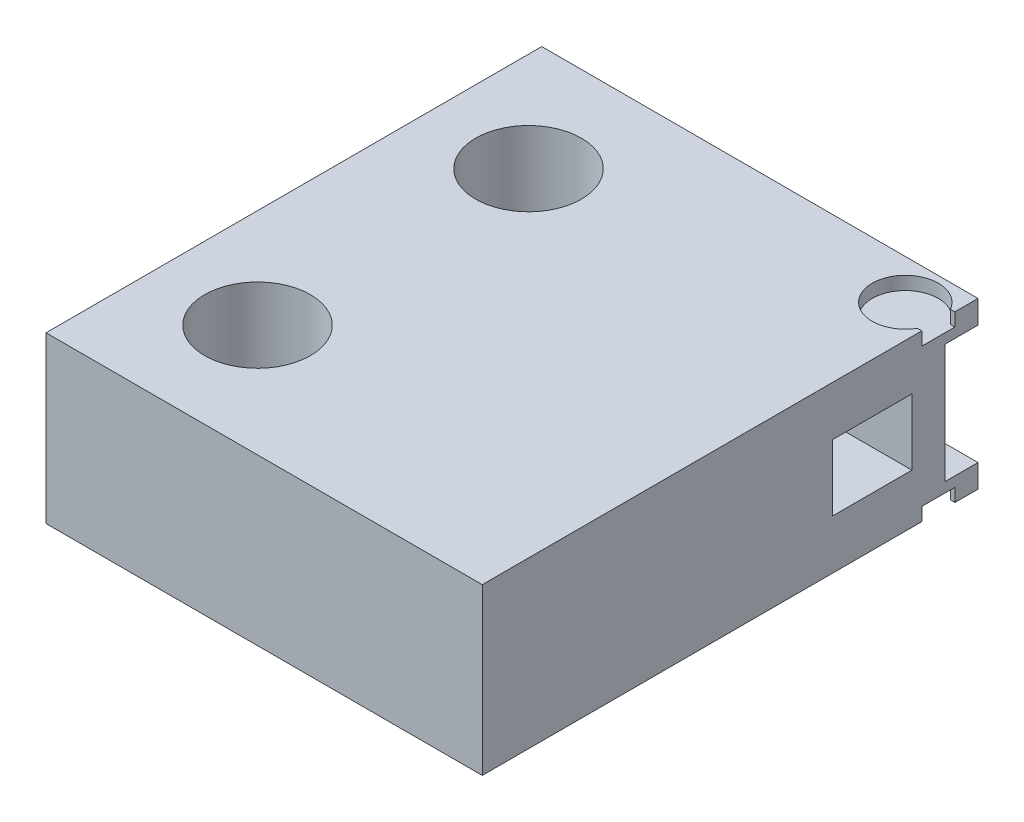
ISO-10303-21;
HEADER;
FILE_DESCRIPTION(('STEP AP214'),'2;1');
FILE_NAME('part.step','',(''),(''),'','','');
FILE_SCHEMA(('AUTOMOTIVE_DESIGN { 1 0 10303 214 1 1 1 1 }'));
ENDSEC;
DATA;
#1=APPLICATION_CONTEXT('core data for automotive mechanical design processes');
#2=APPLICATION_PROTOCOL_DEFINITION('international standard','automotive_design',2000,#1);
#3=PRODUCT_CONTEXT('',#1,'mechanical');
#4=PRODUCT('Part','Part','',(#3));
#5=PRODUCT_RELATED_PRODUCT_CATEGORY('part','',(#4));
#6=PRODUCT_DEFINITION_FORMATION('','',#4);
#7=PRODUCT_DEFINITION_CONTEXT('part definition',#1,'design');
#8=PRODUCT_DEFINITION('design','',#6,#7);
#9=PRODUCT_DEFINITION_SHAPE('','',#8);
#10=(LENGTH_UNIT() NAMED_UNIT(*) SI_UNIT(.MILLI.,.METRE.));
#11=(NAMED_UNIT(*) PLANE_ANGLE_UNIT() SI_UNIT($,.RADIAN.));
#12=(NAMED_UNIT(*) SI_UNIT($,.STERADIAN.) SOLID_ANGLE_UNIT());
#13=UNCERTAINTY_MEASURE_WITH_UNIT(LENGTH_MEASURE(1.E-05),#10,'distance_accuracy_value','');
#14=(GEOMETRIC_REPRESENTATION_CONTEXT(3) GLOBAL_UNCERTAINTY_ASSIGNED_CONTEXT((#13)) GLOBAL_UNIT_ASSIGNED_CONTEXT((#10,
#11,#12)) REPRESENTATION_CONTEXT('',''));
#15=CARTESIAN_POINT('',(0.,0.,0.));
#16=DIRECTION('',(0.,0.,1.));
#17=DIRECTION('',(1.,0.,0.));
#18=AXIS2_PLACEMENT_3D('',#15,#16,#17);
#19=CARTESIAN_POINT('',(93.8,-96.95,20.05551362713));
#20=DIRECTION('',(0.,0.,1.));
#21=DIRECTION('',(1.,0.,0.));
#22=AXIS2_PLACEMENT_3D('',#19,#20,#21);
#23=PLANE('',#22);
#24=DIRECTION('',(0.,1.,0.));
#25=VECTOR('',#24,1.);
#26=CARTESIAN_POINT('',(92.8,-96.95,20.05551362713));
#27=LINE('',#26,#25);
#28=CARTESIAN_POINT('',(92.8,-96.45,20.05551362713));
#29=VERTEX_POINT('',#28);
#30=CARTESIAN_POINT('',(92.8,-97.45,20.05551362713));
#31=VERTEX_POINT('',#30);
#32=EDGE_CURVE('E330',#29,#31,#27,.F.);
#33=ORIENTED_EDGE('',*,*,#32,.F.);
#34=DIRECTION('',(1.,0.,0.));
#35=VECTOR('',#34,1.);
#36=CARTESIAN_POINT('',(93.8,-96.45,20.05551362713));
#37=LINE('',#36,#35);
#38=CARTESIAN_POINT('',(94.8,-96.45,20.05551362713));
#39=VERTEX_POINT('',#38);
#40=EDGE_CURVE('E335',#29,#39,#37,.T.);
#41=ORIENTED_EDGE('',*,*,#40,.T.);
#42=DIRECTION('',(0.,1.,0.));
#43=VECTOR('',#42,1.);
#44=CARTESIAN_POINT('',(94.8,-96.95,20.05551362713));
#45=LINE('',#44,#43);
#46=CARTESIAN_POINT('',(94.8,-97.45,20.05551362713));
#47=VERTEX_POINT('',#46);
#48=EDGE_CURVE('E341',#47,#39,#45,.T.);
#49=ORIENTED_EDGE('',*,*,#48,.F.);
#50=DIRECTION('',(1.,0.,0.));
#51=VECTOR('',#50,1.);
#52=CARTESIAN_POINT('',(93.8,-97.45,20.05551362713));
#53=LINE('',#52,#51);
#54=EDGE_CURVE('E324',#31,#47,#53,.T.);
#55=ORIENTED_EDGE('',*,*,#54,.F.);
#56=EDGE_LOOP('',(#33,#41,#49,#55));
#57=FACE_BOUND('',#56,.T.);
#58=ADVANCED_FACE('F17',(#57),#23,.F.);
#59=CARTESIAN_POINT('',(93.8,-96.95,18.15551362713));
#60=DIRECTION('',(0.,0.,1.));
#61=DIRECTION('',(1.,0.,0.));
#62=AXIS2_PLACEMENT_3D('',#59,#60,#61);
#63=PLANE('',#62);
#64=DIRECTION('',(0.,1.,0.));
#65=VECTOR('',#64,1.);
#66=CARTESIAN_POINT('',(93.2,-96.95,18.15551362713));
#67=LINE('',#66,#65);
#68=CARTESIAN_POINT('',(93.2,-96.05,18.15551362713));
#69=VERTEX_POINT('',#68);
#70=CARTESIAN_POINT('',(93.2,-97.85,18.15551362713));
#71=VERTEX_POINT('',#70);
#72=EDGE_CURVE('E279',#69,#71,#67,.F.);
#73=ORIENTED_EDGE('',*,*,#72,.F.);
#74=DIRECTION('',(1.,0.,0.));
#75=VECTOR('',#74,1.);
#76=CARTESIAN_POINT('',(94.,-96.05,18.15551362713));
#77=LINE('',#76,#75);
#78=CARTESIAN_POINT('',(94.4000000000012,-96.05,18.1555136271281));
#79=VERTEX_POINT('',#78);
#80=EDGE_CURVE('E127',#69,#79,#77,.T.);
#81=ORIENTED_EDGE('',*,*,#80,.T.);
#82=DIRECTION('',(0.,1.,0.));
#83=VECTOR('',#82,1.);
#84=CARTESIAN_POINT('',(94.4000000000019,-96.95,18.1555136271262));
#85=LINE('',#84,#83);
#86=CARTESIAN_POINT('',(94.4000000000005,-97.85,18.1555136271291));
#87=VERTEX_POINT('',#86);
#88=EDGE_CURVE('E132',#79,#87,#85,.F.);
#89=ORIENTED_EDGE('',*,*,#88,.T.);
#90=DIRECTION('',(1.,0.,0.));
#91=VECTOR('',#90,1.);
#92=CARTESIAN_POINT('',(94.,-97.85,18.15551362713));
#93=LINE('',#92,#91);
#94=EDGE_CURVE('E74',#71,#87,#93,.T.);
#95=ORIENTED_EDGE('',*,*,#94,.F.);
#96=EDGE_LOOP('',(#73,#81,#89,#95));
#97=FACE_BOUND('',#96,.T.);
#98=ADVANCED_FACE('F451',(#97),#63,.F.);
#99=CARTESIAN_POINT('',(93.8,-96.45,19.45551362713));
#100=DIRECTION('',(0.,1.,0.));
#101=DIRECTION('',(0.,0.,1.));
#102=AXIS2_PLACEMENT_3D('',#99,#100,#101);
#103=PLANE('',#102);
#104=DIRECTION('',(0.,0.,-1.));
#105=VECTOR('',#104,1.);
#106=CARTESIAN_POINT('',(92.8,-96.45,19.45551362713));
#107=LINE('',#106,#105);
#108=CARTESIAN_POINT('',(92.8,-96.45,18.85551362713));
#109=VERTEX_POINT('',#108);
#110=EDGE_CURVE('E332',#109,#29,#107,.F.);
#111=ORIENTED_EDGE('',*,*,#110,.F.);
#112=DIRECTION('',(1.,0.,0.));
#113=VECTOR('',#112,1.);
#114=CARTESIAN_POINT('',(93.8,-96.45,18.85551362713));
#115=LINE('',#114,#113);
#116=CARTESIAN_POINT('',(94.8,-96.45,18.85551362713));
#117=VERTEX_POINT('',#116);
#118=EDGE_CURVE('E244',#117,#109,#115,.F.);
#119=ORIENTED_EDGE('',*,*,#118,.F.);
#120=DIRECTION('',(0.,0.,1.));
#121=VECTOR('',#120,1.);
#122=CARTESIAN_POINT('',(94.8,-96.45,19.45551362713));
#123=LINE('',#122,#121);
#124=EDGE_CURVE('E338',#39,#117,#123,.F.);
#125=ORIENTED_EDGE('',*,*,#124,.F.);
#126=ORIENTED_EDGE('',*,*,#40,.F.);
#127=EDGE_LOOP('',(#111,#119,#125,#126));
#128=FACE_BOUND('',#127,.T.);
#129=ADVANCED_FACE('F446',(#128),#103,.F.);
#130=CARTESIAN_POINT('',(92.8,-96.95,19.45551362713));
#131=DIRECTION('',(1.,0.,0.));
#132=DIRECTION('',(0.,0.,-1.));
#133=AXIS2_PLACEMENT_3D('',#130,#131,#132);
#134=PLANE('',#133);
#135=DIRECTION('',(0.,0.,1.));
#136=VECTOR('',#135,1.);
#137=CARTESIAN_POINT('',(92.8,-97.45,19.45551362713));
#138=LINE('',#137,#136);
#139=CARTESIAN_POINT('',(92.8,-97.45,18.85551362713));
#140=VERTEX_POINT('',#139);
#141=EDGE_CURVE('E327',#140,#31,#138,.T.);
#142=ORIENTED_EDGE('',*,*,#141,.F.);
#143=DIRECTION('',(0.,1.,0.));
#144=VECTOR('',#143,1.);
#145=CARTESIAN_POINT('',(92.8,-96.95,18.85551362713));
#146=LINE('',#145,#144);
#147=EDGE_CURVE('E241',#109,#140,#146,.F.);
#148=ORIENTED_EDGE('',*,*,#147,.F.);
#149=ORIENTED_EDGE('',*,*,#110,.T.);
#150=ORIENTED_EDGE('',*,*,#32,.T.);
#151=EDGE_LOOP('',(#142,#148,#149,#150));
#152=FACE_BOUND('',#151,.T.);
#153=ADVANCED_FACE('F433',(#152),#134,.T.);
#154=CARTESIAN_POINT('',(93.8,-97.45,19.45551362713));
#155=DIRECTION('',(0.,1.,0.));
#156=DIRECTION('',(0.,0.,1.));
#157=AXIS2_PLACEMENT_3D('',#154,#155,#156);
#158=PLANE('',#157);
#159=ORIENTED_EDGE('',*,*,#54,.T.);
#160=DIRECTION('',(0.,0.,1.));
#161=VECTOR('',#160,1.);
#162=CARTESIAN_POINT('',(94.8,-97.45,19.45551362713));
#163=LINE('',#162,#161);
#164=CARTESIAN_POINT('',(94.8,-97.45,18.85551362713));
#165=VERTEX_POINT('',#164);
#166=EDGE_CURVE('E321',#47,#165,#163,.F.);
#167=ORIENTED_EDGE('',*,*,#166,.T.);
#168=DIRECTION('',(1.,0.,0.));
#169=VECTOR('',#168,1.);
#170=CARTESIAN_POINT('',(93.8,-97.45,18.85551362713));
#171=LINE('',#170,#169);
#172=EDGE_CURVE('E220',#140,#165,#171,.T.);
#173=ORIENTED_EDGE('',*,*,#172,.F.);
#174=ORIENTED_EDGE('',*,*,#141,.T.);
#175=EDGE_LOOP('',(#159,#167,#173,#174));
#176=FACE_BOUND('',#175,.T.);
#177=ADVANCED_FACE('F437',(#176),#158,.T.);
#178=CARTESIAN_POINT('',(94.3,-97.9876417477,18.45551362713));
#179=DIRECTION('',(0.,-1.,0.));
#180=DIRECTION('',(0.,0.,-1.));
#181=AXIS2_PLACEMENT_3D('',#178,#179,#180);
#182=CYLINDRICAL_SURFACE('',#181,0.5);
#183=DIRECTION('',(0.,1.,0.));
#184=VECTOR('',#183,1.);
#185=CARTESIAN_POINT('',(94.73301270189,-98.1,18.20551362713));
#186=LINE('',#185,#184);
#187=CARTESIAN_POINT('',(94.7330127018911,-98.,18.20551362713));
#188=VERTEX_POINT('',#187);
#189=CARTESIAN_POINT('',(94.7330127018911,-98.2,18.20551362713));
#190=VERTEX_POINT('',#189);
#191=EDGE_CURVE('E315',#188,#190,#186,.F.);
#192=ORIENTED_EDGE('',*,*,#191,.F.);
#193=CARTESIAN_POINT('',(94.3,-98.,18.45551362713));
#194=DIRECTION('',(0.,-1.,0.));
#195=DIRECTION('',(0.,0.,-1.));
#196=AXIS2_PLACEMENT_3D('',#193,#194,#195);
#197=CIRCLE('',#196,0.5);
#198=CARTESIAN_POINT('',(94.7330127018911,-98.,18.70551362713));
#199=VERTEX_POINT('',#198);
#200=EDGE_CURVE('E20',#188,#199,#197,.F.);
#201=ORIENTED_EDGE('',*,*,#200,.T.);
#202=DIRECTION('',(0.,1.,0.));
#203=VECTOR('',#202,1.);
#204=CARTESIAN_POINT('',(94.73301270189,-98.1,18.70551362713));
#205=LINE('',#204,#203);
#206=CARTESIAN_POINT('',(94.7330127018911,-98.2,18.70551362713));
#207=VERTEX_POINT('',#206);
#208=EDGE_CURVE('E278',#199,#207,#205,.F.);
#209=ORIENTED_EDGE('',*,*,#208,.T.);
#210=CARTESIAN_POINT('',(94.3,-98.2,18.45551362713));
#211=DIRECTION('',(0.,-1.,0.));
#212=DIRECTION('',(0.,0.,-1.));
#213=AXIS2_PLACEMENT_3D('',#210,#211,#212);
#214=CIRCLE('',#213,0.5);
#215=EDGE_CURVE('E215',#207,#190,#214,.T.);
#216=ORIENTED_EDGE('',*,*,#215,.T.);
#217=EDGE_LOOP('',(#192,#201,#209,#216));
#218=FACE_BOUND('',#217,.T.);
#219=ADVANCED_FACE('F383',(#218),#182,.F.);
#220=CARTESIAN_POINT('',(94.,-96.05,18.10551362713));
#221=DIRECTION('',(0.,1.,0.));
#222=DIRECTION('',(0.,0.,1.));
#223=AXIS2_PLACEMENT_3D('',#220,#221,#222);
#224=PLANE('',#223);
#225=DIRECTION('',(1.,0.,0.));
#226=VECTOR('',#225,1.);
#227=CARTESIAN_POINT('',(91.5,-96.05,17.85551362713));
#228=LINE('',#227,#226);
#229=CARTESIAN_POINT('',(93.2,-96.05,17.85551362713));
#230=VERTEX_POINT('',#229);
#231=CARTESIAN_POINT('',(94.8,-96.05,17.85551362713));
#232=VERTEX_POINT('',#231);
#233=EDGE_CURVE('E231',#230,#232,#228,.T.);
#234=ORIENTED_EDGE('',*,*,#233,.T.);
#235=DIRECTION('',(0.,0.,1.));
#236=VECTOR('',#235,1.);
#237=CARTESIAN_POINT('',(94.8,-96.05,18.10551362713));
#238=LINE('',#237,#236);
#239=CARTESIAN_POINT('',(94.8,-96.05,18.35551362713));
#240=VERTEX_POINT('',#239);
#241=EDGE_CURVE('E285',#240,#232,#238,.F.);
#242=ORIENTED_EDGE('',*,*,#241,.F.);
#243=DIRECTION('',(0.894427190991436,0.,0.447213595516918));
#244=VECTOR('',#243,1.);
#245=CARTESIAN_POINT('',(94.6,-96.05,18.25551362713));
#246=LINE('',#245,#244);
#247=EDGE_CURVE('E247',#240,#79,#246,.F.);
#248=ORIENTED_EDGE('',*,*,#247,.T.);
#249=ORIENTED_EDGE('',*,*,#80,.F.);
#250=DIRECTION('',(0.,0.,-1.));
#251=VECTOR('',#250,1.);
#252=CARTESIAN_POINT('',(93.2,-96.05,18.00551362713));
#253=LINE('',#252,#251);
#254=EDGE_CURVE('E283',#230,#69,#253,.F.);
#255=ORIENTED_EDGE('',*,*,#254,.F.);
#256=EDGE_LOOP('',(#234,#242,#248,#249,#255));
#257=FACE_BOUND('',#256,.T.);
#258=ADVANCED_FACE('F516',(#257),#224,.F.);
#259=CARTESIAN_POINT('',(94.,-97.85,18.10551362713));
#260=DIRECTION('',(0.,1.,0.));
#261=DIRECTION('',(0.,0.,1.));
#262=AXIS2_PLACEMENT_3D('',#259,#260,#261);
#263=PLANE('',#262);
#264=DIRECTION('',(0.894427190991436,0.,0.447213595516918));
#265=VECTOR('',#264,1.);
#266=CARTESIAN_POINT('',(94.6,-97.85,18.25551362713));
#267=LINE('',#266,#265);
#268=CARTESIAN_POINT('',(94.7999999999995,-97.85,18.3555136271309));
#269=VERTEX_POINT('',#268);
#270=EDGE_CURVE('E248',#87,#269,#267,.T.);
#271=ORIENTED_EDGE('',*,*,#270,.T.);
#272=DIRECTION('',(0.,0.,1.));
#273=VECTOR('',#272,1.);
#274=CARTESIAN_POINT('',(94.8,-97.85,18.10551362713));
#275=LINE('',#274,#273);
#276=CARTESIAN_POINT('',(94.8,-97.85,17.85551362713));
#277=VERTEX_POINT('',#276);
#278=EDGE_CURVE('E280',#269,#277,#275,.F.);
#279=ORIENTED_EDGE('',*,*,#278,.T.);
#280=DIRECTION('',(1.,0.,0.));
#281=VECTOR('',#280,1.);
#282=CARTESIAN_POINT('',(91.5,-97.85,17.85551362713));
#283=LINE('',#282,#281);
#284=CARTESIAN_POINT('',(93.2,-97.85,17.85551362713));
#285=VERTEX_POINT('',#284);
#286=EDGE_CURVE('E195',#277,#285,#283,.F.);
#287=ORIENTED_EDGE('',*,*,#286,.T.);
#288=DIRECTION('',(0.,0.,-1.));
#289=VECTOR('',#288,1.);
#290=CARTESIAN_POINT('',(93.2,-97.85,18.00551362713));
#291=LINE('',#290,#289);
#292=EDGE_CURVE('E275',#71,#285,#291,.T.);
#293=ORIENTED_EDGE('',*,*,#292,.F.);
#294=ORIENTED_EDGE('',*,*,#94,.T.);
#295=EDGE_LOOP('',(#271,#279,#287,#293,#294));
#296=FACE_BOUND('',#295,.T.);
#297=ADVANCED_FACE('F512',(#296),#263,.T.);
#298=CARTESIAN_POINT('',(93.2,-96.95,18.00551362713));
#299=DIRECTION('',(1.,0.,0.));
#300=DIRECTION('',(0.,0.,-1.));
#301=AXIS2_PLACEMENT_3D('',#298,#299,#300);
#302=PLANE('',#301);
#303=ORIENTED_EDGE('',*,*,#292,.T.);
#304=DIRECTION('',(0.,1.,0.));
#305=VECTOR('',#304,1.);
#306=CARTESIAN_POINT('',(93.2,-96.95,17.85551362713));
#307=LINE('',#306,#305);
#308=EDGE_CURVE('E197',#285,#230,#307,.T.);
#309=ORIENTED_EDGE('',*,*,#308,.T.);
#310=ORIENTED_EDGE('',*,*,#254,.T.);
#311=ORIENTED_EDGE('',*,*,#72,.T.);
#312=EDGE_LOOP('',(#303,#309,#310,#311));
#313=FACE_BOUND('',#312,.T.);
#314=ADVANCED_FACE('F509',(#313),#302,.T.);
#315=CARTESIAN_POINT('',(94.76650635094,-98.1,18.70551362713));
#316=DIRECTION('',(0.,0.,1.));
#317=DIRECTION('',(1.,0.,0.));
#318=AXIS2_PLACEMENT_3D('',#315,#316,#317);
#319=PLANE('',#318);
#320=DIRECTION('',(1.,0.,0.));
#321=VECTOR('',#320,1.);
#322=CARTESIAN_POINT('',(94.29961431678,-98.,18.70551362713));
#323=LINE('',#322,#321);
#324=CARTESIAN_POINT('',(94.8,-98.,18.70551362713));
#325=VERTEX_POINT('',#324);
#326=EDGE_CURVE('E251',#199,#325,#323,.T.);
#327=ORIENTED_EDGE('',*,*,#326,.T.);
#328=DIRECTION('',(0.,1.,0.));
#329=VECTOR('',#328,1.);
#330=CARTESIAN_POINT('',(94.8,-96.95,18.70551362713));
#331=LINE('',#330,#329);
#332=CARTESIAN_POINT('',(94.8,-98.2,18.70551362713));
#333=VERTEX_POINT('',#332);
#334=EDGE_CURVE('E262',#333,#325,#331,.T.);
#335=ORIENTED_EDGE('',*,*,#334,.F.);
#336=DIRECTION('',(1.,0.,0.));
#337=VECTOR('',#336,1.);
#338=CARTESIAN_POINT('',(91.5,-98.2,18.70551362713));
#339=LINE('',#338,#337);
#340=EDGE_CURVE('E212',#333,#207,#339,.F.);
#341=ORIENTED_EDGE('',*,*,#340,.T.);
#342=ORIENTED_EDGE('',*,*,#208,.F.);
#343=EDGE_LOOP('',(#327,#335,#341,#342));
#344=FACE_BOUND('',#343,.T.);
#345=ADVANCED_FACE('F396',(#344),#319,.F.);
#346=CARTESIAN_POINT('',(94.29961431678,-98.,18.45551362713));
#347=DIRECTION('',(0.,1.,0.));
#348=DIRECTION('',(0.,0.,1.));
#349=AXIS2_PLACEMENT_3D('',#346,#347,#348);
#350=PLANE('',#349);
#351=ORIENTED_EDGE('',*,*,#200,.F.);
#352=DIRECTION('',(1.,0.,0.));
#353=VECTOR('',#352,1.);
#354=CARTESIAN_POINT('',(94.76650635095,-98.,18.20551362713));
#355=LINE('',#354,#353);
#356=CARTESIAN_POINT('',(94.8,-98.,18.20551362713));
#357=VERTEX_POINT('',#356);
#358=EDGE_CURVE('E253',#357,#188,#355,.F.);
#359=ORIENTED_EDGE('',*,*,#358,.F.);
#360=DIRECTION('',(0.,0.,-1.));
#361=VECTOR('',#360,1.);
#362=CARTESIAN_POINT('',(94.8,-98.,21.60551362713));
#363=LINE('',#362,#361);
#364=EDGE_CURVE('E312',#325,#357,#363,.T.);
#365=ORIENTED_EDGE('',*,*,#364,.F.);
#366=ORIENTED_EDGE('',*,*,#326,.F.);
#367=EDGE_LOOP('',(#351,#359,#365,#366));
#368=FACE_BOUND('',#367,.T.);
#369=ADVANCED_FACE('F392',(#368),#350,.F.);
#370=CARTESIAN_POINT('',(94.76650635095,-98.1,18.20551362713));
#371=DIRECTION('',(0.,0.,1.));
#372=DIRECTION('',(1.,0.,0.));
#373=AXIS2_PLACEMENT_3D('',#370,#371,#372);
#374=PLANE('',#373);
#375=ORIENTED_EDGE('',*,*,#191,.T.);
#376=DIRECTION('',(1.,0.,0.));
#377=VECTOR('',#376,1.);
#378=CARTESIAN_POINT('',(91.5,-98.2,18.20551362713));
#379=LINE('',#378,#377);
#380=CARTESIAN_POINT('',(94.8,-98.2,18.20551362713));
#381=VERTEX_POINT('',#380);
#382=EDGE_CURVE('E216',#190,#381,#379,.T.);
#383=ORIENTED_EDGE('',*,*,#382,.T.);
#384=DIRECTION('',(0.,1.,0.));
#385=VECTOR('',#384,1.);
#386=CARTESIAN_POINT('',(94.8,-96.95,18.20551362713));
#387=LINE('',#386,#385);
#388=EDGE_CURVE('E295',#357,#381,#387,.F.);
#389=ORIENTED_EDGE('',*,*,#388,.F.);
#390=ORIENTED_EDGE('',*,*,#358,.T.);
#391=EDGE_LOOP('',(#375,#383,#389,#390));
#392=FACE_BOUND('',#391,.T.);
#393=ADVANCED_FACE('F389',(#392),#374,.T.);
#394=CARTESIAN_POINT('',(94.6,-96.95,18.25551362713));
#395=DIRECTION('',(-0.447213595516918,0.,0.894427190991436));
#396=DIRECTION('',(0.894427190991436,0.,0.447213595516918));
#397=AXIS2_PLACEMENT_3D('',#394,#395,#396);
#398=PLANE('',#397);
#399=DIRECTION('',(0.,1.,0.));
#400=VECTOR('',#399,1.);
#401=CARTESIAN_POINT('',(94.8,-96.95,18.35551362713));
#402=LINE('',#401,#400);
#403=EDGE_CURVE('E289',#269,#240,#402,.T.);
#404=ORIENTED_EDGE('',*,*,#403,.F.);
#405=ORIENTED_EDGE('',*,*,#270,.F.);
#406=ORIENTED_EDGE('',*,*,#88,.F.);
#407=ORIENTED_EDGE('',*,*,#247,.F.);
#408=EDGE_LOOP('',(#404,#405,#406,#407));
#409=FACE_BOUND('',#408,.T.);
#410=ADVANCED_FACE('F499',(#409),#398,.F.);
#411=CARTESIAN_POINT('',(93.8,-96.95,18.85551362713));
#412=DIRECTION('',(0.,0.,1.));
#413=DIRECTION('',(1.,0.,0.));
#414=AXIS2_PLACEMENT_3D('',#411,#412,#413);
#415=PLANE('',#414);
#416=ORIENTED_EDGE('',*,*,#172,.T.);
#417=DIRECTION('',(0.,1.,0.));
#418=VECTOR('',#417,1.);
#419=CARTESIAN_POINT('',(94.8,-96.95,18.85551362713));
#420=LINE('',#419,#418);
#421=EDGE_CURVE('E226',#117,#165,#420,.F.);
#422=ORIENTED_EDGE('',*,*,#421,.F.);
#423=ORIENTED_EDGE('',*,*,#118,.T.);
#424=ORIENTED_EDGE('',*,*,#147,.T.);
#425=EDGE_LOOP('',(#416,#422,#423,#424));
#426=FACE_BOUND('',#425,.T.);
#427=ADVANCED_FACE('F442',(#426),#415,.T.);
#428=CARTESIAN_POINT('',(94.29961431678,-95.9,18.45551362713));
#429=DIRECTION('',(0.,1.,0.));
#430=DIRECTION('',(0.,0.,1.));
#431=AXIS2_PLACEMENT_3D('',#428,#429,#430);
#432=PLANE('',#431);
#433=DIRECTION('',(1.,0.,0.));
#434=VECTOR('',#433,1.);
#435=CARTESIAN_POINT('',(94.76650635095,-95.9,18.70551362713));
#436=LINE('',#435,#434);
#437=CARTESIAN_POINT('',(94.7330127018919,-95.9,18.7055136271305));
#438=VERTEX_POINT('',#437);
#439=CARTESIAN_POINT('',(94.8,-95.9,18.70551362713));
#440=VERTEX_POINT('',#439);
#441=EDGE_CURVE('E223',#438,#440,#436,.T.);
#442=ORIENTED_EDGE('',*,*,#441,.T.);
#443=DIRECTION('',(0.,0.,-1.));
#444=VECTOR('',#443,1.);
#445=CARTESIAN_POINT('',(94.8,-95.9,21.60551362713));
#446=LINE('',#445,#444);
#447=CARTESIAN_POINT('',(94.8,-95.9,18.20551362713));
#448=VERTEX_POINT('',#447);
#449=EDGE_CURVE('E209',#448,#440,#446,.F.);
#450=ORIENTED_EDGE('',*,*,#449,.F.);
#451=DIRECTION('',(1.,0.,0.));
#452=VECTOR('',#451,1.);
#453=CARTESIAN_POINT('',(94.76650635095,-95.9,18.20551362713));
#454=LINE('',#453,#452);
#455=CARTESIAN_POINT('',(94.7330127018919,-95.9,18.2055136271295));
#456=VERTEX_POINT('',#455);
#457=EDGE_CURVE('E229',#456,#448,#454,.T.);
#458=ORIENTED_EDGE('',*,*,#457,.F.);
#459=CARTESIAN_POINT('',(94.3,-95.9,18.45551362713));
#460=DIRECTION('',(0.,-1.,0.));
#461=DIRECTION('',(0.,0.,-1.));
#462=AXIS2_PLACEMENT_3D('',#459,#460,#461);
#463=CIRCLE('',#462,0.5);
#464=EDGE_CURVE('E379',#456,#438,#463,.F.);
#465=ORIENTED_EDGE('',*,*,#464,.T.);
#466=EDGE_LOOP('',(#442,#450,#458,#465));
#467=FACE_BOUND('',#466,.T.);
#468=ADVANCED_FACE('F492',(#467),#432,.T.);
#469=CARTESIAN_POINT('',(91.5,-98.2,21.60551362713));
#470=DIRECTION('',(0.,1.,0.));
#471=DIRECTION('',(0.,0.,1.));
#472=AXIS2_PLACEMENT_3D('',#469,#470,#471);
#473=PLANE('',#472);
#474=CARTESIAN_POINT('',(89.7,-98.2,23.65551362713));
#475=DIRECTION('',(0.,-1.,0.));
#476=DIRECTION('',(0.,0.,-1.));
#477=AXIS2_PLACEMENT_3D('',#474,#475,#476);
#478=CIRCLE('',#477,0.8);
#479=CARTESIAN_POINT('',(89.7,-98.2,22.85551362713));
#480=VERTEX_POINT('',#479);
#481=EDGE_CURVE('E373',#480,#480,#478,.F.);
#482=ORIENTED_EDGE('',*,*,#481,.T.);
#483=EDGE_LOOP('',(#482));
#484=FACE_BOUND('',#483,.T.);
#485=CARTESIAN_POINT('',(89.7,-98.2,19.55551362713));
#486=DIRECTION('',(0.,-1.,0.));
#487=DIRECTION('',(0.,0.,-1.));
#488=AXIS2_PLACEMENT_3D('',#485,#486,#487);
#489=CIRCLE('',#488,0.8);
#490=CARTESIAN_POINT('',(89.7,-98.2,18.75551362713));
#491=VERTEX_POINT('',#490);
#492=EDGE_CURVE('E376',#491,#491,#489,.F.);
#493=ORIENTED_EDGE('',*,*,#492,.T.);
#494=EDGE_LOOP('',(#493));
#495=FACE_BOUND('',#494,.T.);
#496=ORIENTED_EDGE('',*,*,#215,.F.);
#497=ORIENTED_EDGE('',*,*,#340,.F.);
#498=DIRECTION('',(0.,0.,-1.));
#499=VECTOR('',#498,1.);
#500=CARTESIAN_POINT('',(94.8,-98.2,21.60551362713));
#501=LINE('',#500,#499);
#502=CARTESIAN_POINT('',(94.8,-98.2,25.35551362713));
#503=VERTEX_POINT('',#502);
#504=EDGE_CURVE('E259',#503,#333,#501,.T.);
#505=ORIENTED_EDGE('',*,*,#504,.F.);
#506=DIRECTION('',(1.,0.,0.));
#507=VECTOR('',#506,1.);
#508=CARTESIAN_POINT('',(91.5,-98.2,25.35551362713));
#509=LINE('',#508,#507);
#510=CARTESIAN_POINT('',(88.2,-98.2,25.35551362713));
#511=VERTEX_POINT('',#510);
#512=EDGE_CURVE('E204',#511,#503,#509,.T.);
#513=ORIENTED_EDGE('',*,*,#512,.F.);
#514=DIRECTION('',(0.,0.,-1.));
#515=VECTOR('',#514,1.);
#516=CARTESIAN_POINT('',(88.2,-98.2,21.60551362713));
#517=LINE('',#516,#515);
#518=CARTESIAN_POINT('',(88.2,-98.2,17.85551362713));
#519=VERTEX_POINT('',#518);
#520=EDGE_CURVE('E171',#511,#519,#517,.T.);
#521=ORIENTED_EDGE('',*,*,#520,.T.);
#522=DIRECTION('',(1.,0.,0.));
#523=VECTOR('',#522,1.);
#524=CARTESIAN_POINT('',(91.5,-98.2,17.85551362713));
#525=LINE('',#524,#523);
#526=CARTESIAN_POINT('',(94.8,-98.2,17.85551362713));
#527=VERTEX_POINT('',#526);
#528=EDGE_CURVE('E167',#519,#527,#525,.T.);
#529=ORIENTED_EDGE('',*,*,#528,.T.);
#530=DIRECTION('',(0.,0.,-1.));
#531=VECTOR('',#530,1.);
#532=CARTESIAN_POINT('',(94.8,-98.2,21.60551362713));
#533=LINE('',#532,#531);
#534=EDGE_CURVE('E290',#381,#527,#533,.T.);
#535=ORIENTED_EDGE('',*,*,#534,.F.);
#536=ORIENTED_EDGE('',*,*,#382,.F.);
#537=EDGE_LOOP('',(#496,#497,#505,#513,#521,#529,#535,#536));
#538=FACE_BOUND('',#537,.T.);
#539=ADVANCED_FACE('F386',(#484,#495,#538),#473,.F.);
#540=CARTESIAN_POINT('',(94.76650635095,-95.8,18.20551362713));
#541=DIRECTION('',(0.,0.,1.));
#542=DIRECTION('',(1.,0.,0.));
#543=AXIS2_PLACEMENT_3D('',#540,#541,#542);
#544=PLANE('',#543);
#545=DIRECTION('',(0.,1.,0.));
#546=VECTOR('',#545,1.);
#547=CARTESIAN_POINT('',(94.8,-96.95,18.20551362713));
#548=LINE('',#547,#546);
#549=CARTESIAN_POINT('',(94.8,-95.7,18.20551362713));
#550=VERTEX_POINT('',#549);
#551=EDGE_CURVE('E203',#550,#448,#548,.F.);
#552=ORIENTED_EDGE('',*,*,#551,.F.);
#553=DIRECTION('',(1.,0.,0.));
#554=VECTOR('',#553,1.);
#555=CARTESIAN_POINT('',(91.5,-95.7,18.20551362713));
#556=LINE('',#555,#554);
#557=CARTESIAN_POINT('',(94.7330127018919,-95.7,18.2055136271295));
#558=VERTEX_POINT('',#557);
#559=EDGE_CURVE('E188',#558,#550,#556,.T.);
#560=ORIENTED_EDGE('',*,*,#559,.F.);
#561=DIRECTION('',(0.,-1.,0.));
#562=VECTOR('',#561,1.);
#563=CARTESIAN_POINT('',(94.7330127018917,-95.6876417477,18.205513627129));
#564=LINE('',#563,#562);
#565=EDGE_CURVE('E380',#558,#456,#564,.T.);
#566=ORIENTED_EDGE('',*,*,#565,.T.);
#567=ORIENTED_EDGE('',*,*,#457,.T.);
#568=EDGE_LOOP('',(#552,#560,#566,#567));
#569=FACE_BOUND('',#568,.T.);
#570=ADVANCED_FACE('F486',(#569),#544,.T.);
#571=CARTESIAN_POINT('',(91.5,-96.95,17.85551362713));
#572=DIRECTION('',(0.,0.,1.));
#573=DIRECTION('',(1.,0.,0.));
#574=AXIS2_PLACEMENT_3D('',#571,#572,#573);
#575=PLANE('',#574);
#576=ORIENTED_EDGE('',*,*,#286,.F.);
#577=DIRECTION('',(0.,1.,0.));
#578=VECTOR('',#577,1.);
#579=CARTESIAN_POINT('',(94.8,-96.95,17.85551362713));
#580=LINE('',#579,#578);
#581=EDGE_CURVE('E286',#527,#277,#580,.T.);
#582=ORIENTED_EDGE('',*,*,#581,.F.);
#583=ORIENTED_EDGE('',*,*,#528,.F.);
#584=DIRECTION('',(0.,1.,0.));
#585=VECTOR('',#584,1.);
#586=CARTESIAN_POINT('',(88.2,-96.95,17.85551362713));
#587=LINE('',#586,#585);
#588=CARTESIAN_POINT('',(88.2,-95.7,17.85551362713));
#589=VERTEX_POINT('',#588);
#590=EDGE_CURVE('E158',#519,#589,#587,.T.);
#591=ORIENTED_EDGE('',*,*,#590,.T.);
#592=DIRECTION('',(1.,0.,0.));
#593=VECTOR('',#592,1.);
#594=CARTESIAN_POINT('',(91.5,-95.7,17.85551362713));
#595=LINE('',#594,#593);
#596=CARTESIAN_POINT('',(94.8,-95.7,17.85551362713));
#597=VERTEX_POINT('',#596);
#598=EDGE_CURVE('E164',#597,#589,#595,.F.);
#599=ORIENTED_EDGE('',*,*,#598,.F.);
#600=DIRECTION('',(0.,1.,0.));
#601=VECTOR('',#600,1.);
#602=CARTESIAN_POINT('',(94.8,-96.95,17.85551362713));
#603=LINE('',#602,#601);
#604=EDGE_CURVE('E201',#232,#597,#603,.T.);
#605=ORIENTED_EDGE('',*,*,#604,.F.);
#606=ORIENTED_EDGE('',*,*,#233,.F.);
#607=ORIENTED_EDGE('',*,*,#308,.F.);
#608=EDGE_LOOP('',(#576,#582,#583,#591,#599,#605,#606,#607));
#609=FACE_BOUND('',#608,.T.);
#610=ADVANCED_FACE('F161',(#609),#575,.F.);
#611=CARTESIAN_POINT('',(88.2,-96.95,21.60551362713));
#612=DIRECTION('',(1.,0.,0.));
#613=DIRECTION('',(0.,0.,-1.));
#614=AXIS2_PLACEMENT_3D('',#611,#612,#613);
#615=PLANE('',#614);
#616=ORIENTED_EDGE('',*,*,#520,.F.);
#617=DIRECTION('',(0.,1.,0.));
#618=VECTOR('',#617,1.);
#619=CARTESIAN_POINT('',(88.2,-96.95,25.35551362713));
#620=LINE('',#619,#618);
#621=CARTESIAN_POINT('',(88.2,-95.7,25.35551362713));
#622=VERTEX_POINT('',#621);
#623=EDGE_CURVE('E170',#622,#511,#620,.F.);
#624=ORIENTED_EDGE('',*,*,#623,.F.);
#625=DIRECTION('',(0.,0.,1.));
#626=VECTOR('',#625,1.);
#627=CARTESIAN_POINT('',(88.2,-95.7,21.60551362713));
#628=LINE('',#627,#626);
#629=EDGE_CURVE('E174',#589,#622,#628,.T.);
#630=ORIENTED_EDGE('',*,*,#629,.F.);
#631=ORIENTED_EDGE('',*,*,#590,.F.);
#632=EDGE_LOOP('',(#616,#624,#630,#631));
#633=FACE_BOUND('',#632,.T.);
#634=ADVANCED_FACE('F175',(#633),#615,.F.);
#635=CARTESIAN_POINT('',(91.5,-96.95,25.35551362713));
#636=DIRECTION('',(0.,0.,1.));
#637=DIRECTION('',(1.,0.,0.));
#638=AXIS2_PLACEMENT_3D('',#635,#636,#637);
#639=PLANE('',#638);
#640=DIRECTION('',(0.,1.,0.));
#641=VECTOR('',#640,1.);
#642=CARTESIAN_POINT('',(94.8,-96.95,25.35551362713));
#643=LINE('',#642,#641);
#644=CARTESIAN_POINT('',(94.8,-95.7,25.35551362713));
#645=VERTEX_POINT('',#644);
#646=EDGE_CURVE('E236',#645,#503,#643,.F.);
#647=ORIENTED_EDGE('',*,*,#646,.F.);
#648=DIRECTION('',(1.,0.,0.));
#649=VECTOR('',#648,1.);
#650=CARTESIAN_POINT('',(91.5,-95.7,25.35551362713));
#651=LINE('',#650,#649);
#652=EDGE_CURVE('E180',#622,#645,#651,.T.);
#653=ORIENTED_EDGE('',*,*,#652,.F.);
#654=ORIENTED_EDGE('',*,*,#623,.T.);
#655=ORIENTED_EDGE('',*,*,#512,.T.);
#656=EDGE_LOOP('',(#647,#653,#654,#655));
#657=FACE_BOUND('',#656,.T.);
#658=ADVANCED_FACE('F420',(#657),#639,.T.);
#659=CARTESIAN_POINT('',(94.8,-96.95,21.60551362713));
#660=DIRECTION('',(1.,0.,0.));
#661=DIRECTION('',(0.,0.,-1.));
#662=AXIS2_PLACEMENT_3D('',#659,#660,#661);
#663=PLANE('',#662);
#664=ORIENTED_EDGE('',*,*,#124,.T.);
#665=ORIENTED_EDGE('',*,*,#421,.T.);
#666=ORIENTED_EDGE('',*,*,#166,.F.);
#667=ORIENTED_EDGE('',*,*,#48,.T.);
#668=EDGE_LOOP('',(#664,#665,#666,#667));
#669=FACE_BOUND('',#668,.T.);
#670=ORIENTED_EDGE('',*,*,#278,.F.);
#671=ORIENTED_EDGE('',*,*,#403,.T.);
#672=ORIENTED_EDGE('',*,*,#241,.T.);
#673=ORIENTED_EDGE('',*,*,#604,.T.);
#674=DIRECTION('',(0.,0.,1.));
#675=VECTOR('',#674,1.);
#676=CARTESIAN_POINT('',(94.8,-95.7,21.60551362713));
#677=LINE('',#676,#675);
#678=EDGE_CURVE('E186',#550,#597,#677,.F.);
#679=ORIENTED_EDGE('',*,*,#678,.F.);
#680=ORIENTED_EDGE('',*,*,#551,.T.);
#681=ORIENTED_EDGE('',*,*,#449,.T.);
#682=DIRECTION('',(0.,1.,0.));
#683=VECTOR('',#682,1.);
#684=CARTESIAN_POINT('',(94.8,-95.8,18.70551362713));
#685=LINE('',#684,#683);
#686=CARTESIAN_POINT('',(94.8,-95.7,18.70551362713));
#687=VERTEX_POINT('',#686);
#688=EDGE_CURVE('E225',#440,#687,#685,.T.);
#689=ORIENTED_EDGE('',*,*,#688,.T.);
#690=DIRECTION('',(0.,0.,1.));
#691=VECTOR('',#690,1.);
#692=CARTESIAN_POINT('',(94.8,-95.7,21.60551362713));
#693=LINE('',#692,#691);
#694=EDGE_CURVE('E405',#645,#687,#693,.F.);
#695=ORIENTED_EDGE('',*,*,#694,.F.);
#696=ORIENTED_EDGE('',*,*,#646,.T.);
#697=ORIENTED_EDGE('',*,*,#504,.T.);
#698=ORIENTED_EDGE('',*,*,#334,.T.);
#699=ORIENTED_EDGE('',*,*,#364,.T.);
#700=ORIENTED_EDGE('',*,*,#388,.T.);
#701=ORIENTED_EDGE('',*,*,#534,.T.);
#702=ORIENTED_EDGE('',*,*,#581,.T.);
#703=EDGE_LOOP('',(#670,#671,#672,#673,#679,#680,#681,#689,#695,#696,#697,#698,#699,#700,#701,#702));
#704=FACE_BOUND('',#703,.T.);
#705=ADVANCED_FACE('F403',(#669,#704),#663,.T.);
#706=CARTESIAN_POINT('',(94.76650635095,-95.8,18.70551362713));
#707=DIRECTION('',(0.,0.,1.));
#708=DIRECTION('',(1.,0.,0.));
#709=AXIS2_PLACEMENT_3D('',#706,#707,#708);
#710=PLANE('',#709);
#711=ORIENTED_EDGE('',*,*,#441,.F.);
#712=DIRECTION('',(0.,-1.,0.));
#713=VECTOR('',#712,1.);
#714=CARTESIAN_POINT('',(94.7330127018917,-95.6876417477,18.705513627131));
#715=LINE('',#714,#713);
#716=CARTESIAN_POINT('',(94.7330127018919,-95.7,18.7055136271305));
#717=VERTEX_POINT('',#716);
#718=EDGE_CURVE('E35',#438,#717,#715,.F.);
#719=ORIENTED_EDGE('',*,*,#718,.T.);
#720=DIRECTION('',(1.,0.,0.));
#721=VECTOR('',#720,1.);
#722=CARTESIAN_POINT('',(91.5,-95.7,18.70551362713));
#723=LINE('',#722,#721);
#724=EDGE_CURVE('E372',#687,#717,#723,.F.);
#725=ORIENTED_EDGE('',*,*,#724,.F.);
#726=ORIENTED_EDGE('',*,*,#688,.F.);
#727=EDGE_LOOP('',(#711,#719,#725,#726));
#728=FACE_BOUND('',#727,.T.);
#729=ADVANCED_FACE('F474',(#728),#710,.F.);
#730=CARTESIAN_POINT('',(94.3,-95.6876417477,18.45551362713));
#731=DIRECTION('',(0.,-1.,0.));
#732=DIRECTION('',(0.,0.,-1.));
#733=AXIS2_PLACEMENT_3D('',#730,#731,#732);
#734=CYLINDRICAL_SURFACE('',#733,0.5);
#735=ORIENTED_EDGE('',*,*,#464,.F.);
#736=ORIENTED_EDGE('',*,*,#565,.F.);
#737=CARTESIAN_POINT('',(94.3,-95.7,18.45551362713));
#738=DIRECTION('',(0.,-1.,0.));
#739=DIRECTION('',(0.,0.,-1.));
#740=AXIS2_PLACEMENT_3D('',#737,#738,#739);
#741=CIRCLE('',#740,0.5);
#742=EDGE_CURVE('E370',#717,#558,#741,.T.);
#743=ORIENTED_EDGE('',*,*,#742,.F.);
#744=ORIENTED_EDGE('',*,*,#718,.F.);
#745=EDGE_LOOP('',(#735,#736,#743,#744));
#746=FACE_BOUND('',#745,.T.);
#747=ADVANCED_FACE('F470',(#746),#734,.F.);
#748=CARTESIAN_POINT('',(89.7,-95.65,19.55551362713));
#749=DIRECTION('',(0.,-1.,0.));
#750=DIRECTION('',(0.,0.,-1.));
#751=AXIS2_PLACEMENT_3D('',#748,#749,#750);
#752=CYLINDRICAL_SURFACE('',#751,0.8);
#753=ORIENTED_EDGE('',*,*,#492,.F.);
#754=EDGE_LOOP('',(#753));
#755=FACE_BOUND('',#754,.T.);
#756=CARTESIAN_POINT('',(89.7,-95.7,19.55551362713));
#757=DIRECTION('',(0.,-1.,0.));
#758=DIRECTION('',(0.,0.,-1.));
#759=AXIS2_PLACEMENT_3D('',#756,#757,#758);
#760=CIRCLE('',#759,0.8);
#761=CARTESIAN_POINT('',(89.7,-95.7,18.75551362713));
#762=VERTEX_POINT('',#761);
#763=EDGE_CURVE('E26',#762,#762,#760,.T.);
#764=ORIENTED_EDGE('',*,*,#763,.F.);
#765=EDGE_LOOP('',(#764));
#766=FACE_BOUND('',#765,.T.);
#767=ADVANCED_FACE('F463',(#755,#766),#752,.F.);
#768=CARTESIAN_POINT('',(89.7,-95.65,23.65551362713));
#769=DIRECTION('',(0.,-1.,0.));
#770=DIRECTION('',(0.,0.,-1.));
#771=AXIS2_PLACEMENT_3D('',#768,#769,#770);
#772=CYLINDRICAL_SURFACE('',#771,0.8);
#773=ORIENTED_EDGE('',*,*,#481,.F.);
#774=EDGE_LOOP('',(#773));
#775=FACE_BOUND('',#774,.T.);
#776=CARTESIAN_POINT('',(89.7,-95.7,23.65551362713));
#777=DIRECTION('',(0.,-1.,0.));
#778=DIRECTION('',(0.,0.,-1.));
#779=AXIS2_PLACEMENT_3D('',#776,#777,#778);
#780=CIRCLE('',#779,0.8);
#781=CARTESIAN_POINT('',(89.7,-95.7,22.85551362713));
#782=VERTEX_POINT('',#781);
#783=EDGE_CURVE('E11',#782,#782,#780,.T.);
#784=ORIENTED_EDGE('',*,*,#783,.F.);
#785=EDGE_LOOP('',(#784));
#786=FACE_BOUND('',#785,.T.);
#787=ADVANCED_FACE('F457',(#775,#786),#772,.F.);
#788=CARTESIAN_POINT('',(91.5,-95.7,21.60551362713));
#789=DIRECTION('',(0.,1.,0.));
#790=DIRECTION('',(0.,0.,1.));
#791=AXIS2_PLACEMENT_3D('',#788,#789,#790);
#792=PLANE('',#791);
#793=ORIENTED_EDGE('',*,*,#783,.T.);
#794=EDGE_LOOP('',(#793));
#795=FACE_BOUND('',#794,.T.);
#796=ORIENTED_EDGE('',*,*,#763,.T.);
#797=EDGE_LOOP('',(#796));
#798=FACE_BOUND('',#797,.T.);
#799=ORIENTED_EDGE('',*,*,#742,.T.);
#800=ORIENTED_EDGE('',*,*,#559,.T.);
#801=ORIENTED_EDGE('',*,*,#678,.T.);
#802=ORIENTED_EDGE('',*,*,#598,.T.);
#803=ORIENTED_EDGE('',*,*,#629,.T.);
#804=ORIENTED_EDGE('',*,*,#652,.T.);
#805=ORIENTED_EDGE('',*,*,#694,.T.);
#806=ORIENTED_EDGE('',*,*,#724,.T.);
#807=EDGE_LOOP('',(#799,#800,#801,#802,#803,#804,#805,#806));
#808=FACE_BOUND('',#807,.T.);
#809=ADVANCED_FACE('F183',(#795,#798,#808),#792,.T.);
#810=CLOSED_SHELL('',(#58,#98,#129,#153,#177,#219,#258,#297,#314,#345,#369,#393,#410,#427,#468,
#539,#570,#610,#634,#658,#705,#729,#747,#767,#787,#809));
#811=MANIFOLD_SOLID_BREP('B1',#810);
#812=ADVANCED_BREP_SHAPE_REPRESENTATION('',(#18,#811),#14);
#813=SHAPE_DEFINITION_REPRESENTATION(#9,#812);
ENDSEC;
END-ISO-10303-21;
